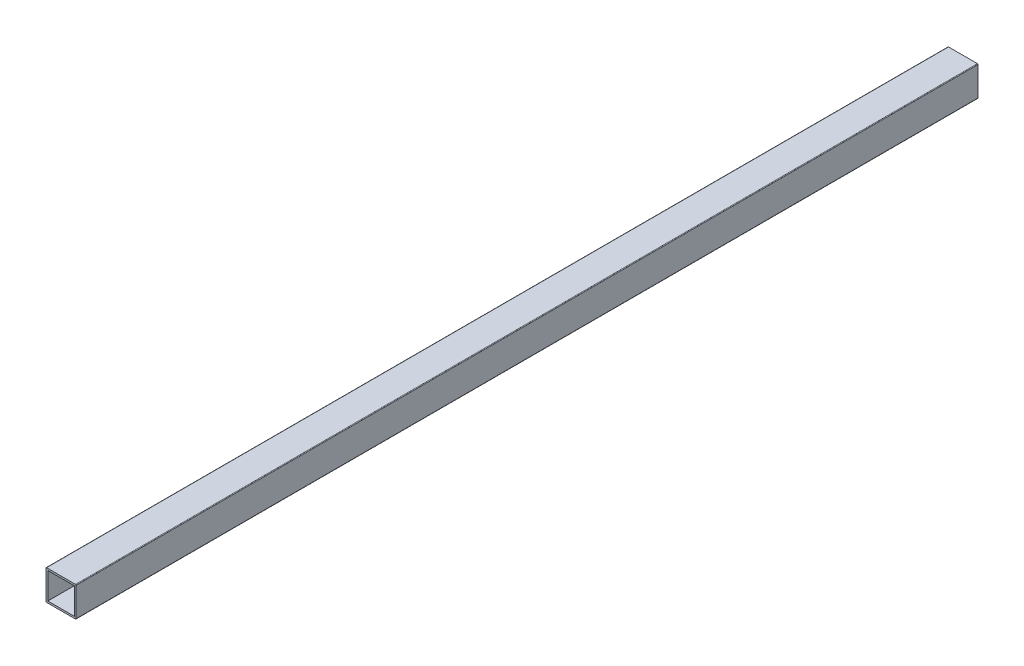
ISO-10303-21;
HEADER;
FILE_DESCRIPTION(('STEP AP214'),'2;1');
FILE_NAME('part.step','',(''),(''),'','','');
FILE_SCHEMA(('AUTOMOTIVE_DESIGN { 1 0 10303 214 1 1 1 1 }'));
ENDSEC;
DATA;
#1=APPLICATION_CONTEXT('core data for automotive mechanical design processes');
#2=APPLICATION_PROTOCOL_DEFINITION('international standard','automotive_design',2000,#1);
#3=PRODUCT_CONTEXT('',#1,'mechanical');
#4=PRODUCT('Part','Part','',(#3));
#5=PRODUCT_RELATED_PRODUCT_CATEGORY('part','',(#4));
#6=PRODUCT_DEFINITION_FORMATION('','',#4);
#7=PRODUCT_DEFINITION_CONTEXT('part definition',#1,'design');
#8=PRODUCT_DEFINITION('design','',#6,#7);
#9=PRODUCT_DEFINITION_SHAPE('','',#8);
#10=(LENGTH_UNIT() NAMED_UNIT(*) SI_UNIT(.MILLI.,.METRE.));
#11=(NAMED_UNIT(*) PLANE_ANGLE_UNIT() SI_UNIT($,.RADIAN.));
#12=(NAMED_UNIT(*) SI_UNIT($,.STERADIAN.) SOLID_ANGLE_UNIT());
#13=UNCERTAINTY_MEASURE_WITH_UNIT(LENGTH_MEASURE(1.E-05),#10,'distance_accuracy_value','');
#14=(GEOMETRIC_REPRESENTATION_CONTEXT(3) GLOBAL_UNCERTAINTY_ASSIGNED_CONTEXT((#13)) GLOBAL_UNIT_ASSIGNED_CONTEXT((#10,
#11,#12)) REPRESENTATION_CONTEXT('',''));
#15=CARTESIAN_POINT('',(0.,0.,0.));
#16=DIRECTION('',(0.,0.,1.));
#17=DIRECTION('',(1.,0.,0.));
#18=AXIS2_PLACEMENT_3D('',#15,#16,#17);
#19=CARTESIAN_POINT('',(24.,24.,1500.));
#20=DIRECTION('',(0.,0.,-1.));
#21=DIRECTION('',(-1.,0.,0.));
#22=AXIS2_PLACEMENT_3D('',#19,#20,#21);
#23=PLANE('',#22);
#24=CARTESIAN_POINT('',(24.,24.,1500.));
#25=DIRECTION('',(0.,0.,1.));
#26=DIRECTION('',(-1.,0.,0.));
#27=AXIS2_PLACEMENT_3D('',#24,#25,#26);
#28=CIRCLE('',#27,1.);
#29=CARTESIAN_POINT('',(25.,24.,1500.));
#30=VERTEX_POINT('',#29);
#31=CARTESIAN_POINT('',(24.,25.,1500.));
#32=VERTEX_POINT('',#31);
#33=EDGE_CURVE('E179',#30,#32,#28,.T.);
#34=ORIENTED_EDGE('',*,*,#33,.T.);
#35=DIRECTION('',(-1.,0.,0.));
#36=VECTOR('',#35,1.);
#37=CARTESIAN_POINT('',(24.,25.,1500.));
#38=LINE('',#37,#36);
#39=CARTESIAN_POINT('',(-24.,25.,1500.));
#40=VERTEX_POINT('',#39);
#41=EDGE_CURVE('E183',#32,#40,#38,.T.);
#42=ORIENTED_EDGE('',*,*,#41,.T.);
#43=CARTESIAN_POINT('',(-24.,24.,1500.));
#44=DIRECTION('',(0.,0.,1.));
#45=DIRECTION('',(-1.,0.,0.));
#46=AXIS2_PLACEMENT_3D('',#43,#44,#45);
#47=CIRCLE('',#46,1.);
#48=CARTESIAN_POINT('',(-25.,24.,1500.));
#49=VERTEX_POINT('',#48);
#50=EDGE_CURVE('E187',#40,#49,#47,.T.);
#51=ORIENTED_EDGE('',*,*,#50,.T.);
#52=DIRECTION('',(0.,-1.,0.));
#53=VECTOR('',#52,1.);
#54=CARTESIAN_POINT('',(-25.,24.,1500.));
#55=LINE('',#54,#53);
#56=CARTESIAN_POINT('',(-25.,-24.,1500.));
#57=VERTEX_POINT('',#56);
#58=EDGE_CURVE('E190',#49,#57,#55,.T.);
#59=ORIENTED_EDGE('',*,*,#58,.T.);
#60=CARTESIAN_POINT('',(-24.,-24.,1500.));
#61=DIRECTION('',(0.,0.,1.));
#62=DIRECTION('',(-1.,0.,0.));
#63=AXIS2_PLACEMENT_3D('',#60,#61,#62);
#64=CIRCLE('',#63,1.);
#65=CARTESIAN_POINT('',(-24.,-25.,1500.));
#66=VERTEX_POINT('',#65);
#67=EDGE_CURVE('E193',#57,#66,#64,.T.);
#68=ORIENTED_EDGE('',*,*,#67,.T.);
#69=DIRECTION('',(1.,0.,0.));
#70=VECTOR('',#69,1.);
#71=CARTESIAN_POINT('',(24.,-25.,1500.));
#72=LINE('',#71,#70);
#73=CARTESIAN_POINT('',(24.,-25.,1500.));
#74=VERTEX_POINT('',#73);
#75=EDGE_CURVE('E196',#66,#74,#72,.T.);
#76=ORIENTED_EDGE('',*,*,#75,.T.);
#77=CARTESIAN_POINT('',(24.,-24.,1500.));
#78=DIRECTION('',(0.,0.,1.));
#79=DIRECTION('',(1.,0.,0.));
#80=AXIS2_PLACEMENT_3D('',#77,#78,#79);
#81=CIRCLE('',#80,1.);
#82=CARTESIAN_POINT('',(25.,-24.,1500.));
#83=VERTEX_POINT('',#82);
#84=EDGE_CURVE('E199',#74,#83,#81,.T.);
#85=ORIENTED_EDGE('',*,*,#84,.T.);
#86=DIRECTION('',(0.,1.,0.));
#87=VECTOR('',#86,1.);
#88=CARTESIAN_POINT('',(25.,24.,1500.));
#89=LINE('',#88,#87);
#90=EDGE_CURVE('E202',#83,#30,#89,.T.);
#91=ORIENTED_EDGE('',*,*,#90,.T.);
#92=EDGE_LOOP('',(#34,#42,#51,#59,#68,#76,#85,#91));
#93=FACE_BOUND('',#92,.T.);
#94=DIRECTION('',(0.,1.,0.));
#95=VECTOR('',#94,1.);
#96=CARTESIAN_POINT('',(22.,22.,1500.));
#97=LINE('',#96,#95);
#98=CARTESIAN_POINT('',(22.,-22.,1500.));
#99=VERTEX_POINT('',#98);
#100=CARTESIAN_POINT('',(22.,22.,1500.));
#101=VERTEX_POINT('',#100);
#102=EDGE_CURVE('E131',#99,#101,#97,.T.);
#103=ORIENTED_EDGE('',*,*,#102,.F.);
#104=DIRECTION('',(1.,0.,0.));
#105=VECTOR('',#104,1.);
#106=CARTESIAN_POINT('',(22.,-22.,1500.));
#107=LINE('',#106,#105);
#108=CARTESIAN_POINT('',(-22.,-22.,1500.));
#109=VERTEX_POINT('',#108);
#110=EDGE_CURVE('E157',#109,#99,#107,.T.);
#111=ORIENTED_EDGE('',*,*,#110,.F.);
#112=DIRECTION('',(0.,-1.,0.));
#113=VECTOR('',#112,1.);
#114=CARTESIAN_POINT('',(-22.,22.,1500.));
#115=LINE('',#114,#113);
#116=CARTESIAN_POINT('',(-22.,22.,1500.));
#117=VERTEX_POINT('',#116);
#118=EDGE_CURVE('E153',#117,#109,#115,.T.);
#119=ORIENTED_EDGE('',*,*,#118,.F.);
#120=DIRECTION('',(-1.,0.,0.));
#121=VECTOR('',#120,1.);
#122=CARTESIAN_POINT('',(22.,22.,1500.));
#123=LINE('',#122,#121);
#124=EDGE_CURVE('E140',#101,#117,#123,.T.);
#125=ORIENTED_EDGE('',*,*,#124,.F.);
#126=EDGE_LOOP('',(#103,#111,#119,#125));
#127=FACE_BOUND('',#126,.T.);
#128=ADVANCED_FACE('F41',(#93,#127),#23,.F.);
#129=CARTESIAN_POINT('',(24.,24.,0.));
#130=DIRECTION('',(0.,0.,-1.));
#131=DIRECTION('',(-1.,0.,0.));
#132=AXIS2_PLACEMENT_3D('',#129,#130,#131);
#133=PLANE('',#132);
#134=CARTESIAN_POINT('',(24.,24.,0.));
#135=DIRECTION('',(0.,0.,1.));
#136=DIRECTION('',(-1.,0.,0.));
#137=AXIS2_PLACEMENT_3D('',#134,#135,#136);
#138=CIRCLE('',#137,1.);
#139=CARTESIAN_POINT('',(25.,24.,0.));
#140=VERTEX_POINT('',#139);
#141=CARTESIAN_POINT('',(24.,25.,0.));
#142=VERTEX_POINT('',#141);
#143=EDGE_CURVE('E149',#140,#142,#138,.T.);
#144=ORIENTED_EDGE('',*,*,#143,.F.);
#145=DIRECTION('',(0.,1.,0.));
#146=VECTOR('',#145,1.);
#147=CARTESIAN_POINT('',(25.,24.,0.));
#148=LINE('',#147,#146);
#149=CARTESIAN_POINT('',(25.,-24.,0.));
#150=VERTEX_POINT('',#149);
#151=EDGE_CURVE('E184',#150,#140,#148,.T.);
#152=ORIENTED_EDGE('',*,*,#151,.F.);
#153=CARTESIAN_POINT('',(24.,-24.,0.));
#154=DIRECTION('',(0.,0.,1.));
#155=DIRECTION('',(1.,0.,0.));
#156=AXIS2_PLACEMENT_3D('',#153,#154,#155);
#157=CIRCLE('',#156,1.);
#158=CARTESIAN_POINT('',(24.,-25.,0.));
#159=VERTEX_POINT('',#158);
#160=EDGE_CURVE('E224',#159,#150,#157,.T.);
#161=ORIENTED_EDGE('',*,*,#160,.F.);
#162=DIRECTION('',(1.,0.,0.));
#163=VECTOR('',#162,1.);
#164=CARTESIAN_POINT('',(24.,-25.,0.));
#165=LINE('',#164,#163);
#166=CARTESIAN_POINT('',(-24.,-25.,0.));
#167=VERTEX_POINT('',#166);
#168=EDGE_CURVE('E221',#167,#159,#165,.T.);
#169=ORIENTED_EDGE('',*,*,#168,.F.);
#170=CARTESIAN_POINT('',(-24.,-24.,0.));
#171=DIRECTION('',(0.,0.,1.));
#172=DIRECTION('',(-1.,0.,0.));
#173=AXIS2_PLACEMENT_3D('',#170,#171,#172);
#174=CIRCLE('',#173,1.);
#175=CARTESIAN_POINT('',(-25.,-24.,0.));
#176=VERTEX_POINT('',#175);
#177=EDGE_CURVE('E218',#176,#167,#174,.T.);
#178=ORIENTED_EDGE('',*,*,#177,.F.);
#179=DIRECTION('',(0.,-1.,0.));
#180=VECTOR('',#179,1.);
#181=CARTESIAN_POINT('',(-25.,24.,0.));
#182=LINE('',#181,#180);
#183=CARTESIAN_POINT('',(-25.,24.,0.));
#184=VERTEX_POINT('',#183);
#185=EDGE_CURVE('E215',#184,#176,#182,.T.);
#186=ORIENTED_EDGE('',*,*,#185,.F.);
#187=CARTESIAN_POINT('',(-24.,24.,0.));
#188=DIRECTION('',(0.,0.,1.));
#189=DIRECTION('',(-1.,0.,0.));
#190=AXIS2_PLACEMENT_3D('',#187,#188,#189);
#191=CIRCLE('',#190,1.);
#192=CARTESIAN_POINT('',(-24.,25.,0.));
#193=VERTEX_POINT('',#192);
#194=EDGE_CURVE('E212',#193,#184,#191,.T.);
#195=ORIENTED_EDGE('',*,*,#194,.F.);
#196=DIRECTION('',(-1.,0.,0.));
#197=VECTOR('',#196,1.);
#198=CARTESIAN_POINT('',(24.,25.,0.));
#199=LINE('',#198,#197);
#200=EDGE_CURVE('E209',#142,#193,#199,.T.);
#201=ORIENTED_EDGE('',*,*,#200,.F.);
#202=EDGE_LOOP('',(#144,#152,#161,#169,#178,#186,#195,#201));
#203=FACE_BOUND('',#202,.T.);
#204=DIRECTION('',(1.,0.,0.));
#205=VECTOR('',#204,1.);
#206=CARTESIAN_POINT('',(22.,-22.,0.));
#207=LINE('',#206,#205);
#208=CARTESIAN_POINT('',(-22.,-22.,0.));
#209=VERTEX_POINT('',#208);
#210=CARTESIAN_POINT('',(22.,-22.,0.));
#211=VERTEX_POINT('',#210);
#212=EDGE_CURVE('E141',#209,#211,#207,.T.);
#213=ORIENTED_EDGE('',*,*,#212,.T.);
#214=DIRECTION('',(0.,1.,0.));
#215=VECTOR('',#214,1.);
#216=CARTESIAN_POINT('',(22.,22.,0.));
#217=LINE('',#216,#215);
#218=CARTESIAN_POINT('',(22.,22.,0.));
#219=VERTEX_POINT('',#218);
#220=EDGE_CURVE('E65',#211,#219,#217,.T.);
#221=ORIENTED_EDGE('',*,*,#220,.T.);
#222=DIRECTION('',(-1.,0.,0.));
#223=VECTOR('',#222,1.);
#224=CARTESIAN_POINT('',(22.,22.,0.));
#225=LINE('',#224,#223);
#226=CARTESIAN_POINT('',(-22.,22.,0.));
#227=VERTEX_POINT('',#226);
#228=EDGE_CURVE('E147',#219,#227,#225,.T.);
#229=ORIENTED_EDGE('',*,*,#228,.T.);
#230=DIRECTION('',(0.,-1.,0.));
#231=VECTOR('',#230,1.);
#232=CARTESIAN_POINT('',(-22.,22.,0.));
#233=LINE('',#232,#231);
#234=EDGE_CURVE('E166',#227,#209,#233,.T.);
#235=ORIENTED_EDGE('',*,*,#234,.T.);
#236=EDGE_LOOP('',(#213,#221,#229,#235));
#237=FACE_BOUND('',#236,.T.);
#238=ADVANCED_FACE('F263',(#203,#237),#133,.T.);
#239=CARTESIAN_POINT('',(24.,24.,1500.));
#240=DIRECTION('',(0.,0.,-1.));
#241=DIRECTION('',(-1.,0.,0.));
#242=AXIS2_PLACEMENT_3D('',#239,#240,#241);
#243=CYLINDRICAL_SURFACE('',#242,1.);
#244=ORIENTED_EDGE('',*,*,#143,.T.);
#245=DIRECTION('',(0.,0.,-1.));
#246=VECTOR('',#245,1.);
#247=CARTESIAN_POINT('',(24.,25.,1500.));
#248=LINE('',#247,#246);
#249=EDGE_CURVE('E11',#32,#142,#248,.T.);
#250=ORIENTED_EDGE('',*,*,#249,.F.);
#251=ORIENTED_EDGE('',*,*,#33,.F.);
#252=DIRECTION('',(0.,0.,-1.));
#253=VECTOR('',#252,1.);
#254=CARTESIAN_POINT('',(25.,24.,1500.));
#255=LINE('',#254,#253);
#256=EDGE_CURVE('E205',#30,#140,#255,.T.);
#257=ORIENTED_EDGE('',*,*,#256,.T.);
#258=EDGE_LOOP('',(#244,#250,#251,#257));
#259=FACE_BOUND('',#258,.T.);
#260=ADVANCED_FACE('F43',(#259),#243,.T.);
#261=CARTESIAN_POINT('',(24.,25.,1500.));
#262=DIRECTION('',(0.,-1.,0.));
#263=DIRECTION('',(1.,0.,0.));
#264=AXIS2_PLACEMENT_3D('',#261,#262,#263);
#265=PLANE('',#264);
#266=ORIENTED_EDGE('',*,*,#200,.T.);
#267=DIRECTION('',(0.,0.,-1.));
#268=VECTOR('',#267,1.);
#269=CARTESIAN_POINT('',(-24.,25.,1500.));
#270=LINE('',#269,#268);
#271=EDGE_CURVE('E50',#40,#193,#270,.T.);
#272=ORIENTED_EDGE('',*,*,#271,.F.);
#273=ORIENTED_EDGE('',*,*,#41,.F.);
#274=ORIENTED_EDGE('',*,*,#249,.T.);
#275=EDGE_LOOP('',(#266,#272,#273,#274));
#276=FACE_BOUND('',#275,.T.);
#277=ADVANCED_FACE('F280',(#276),#265,.F.);
#278=CARTESIAN_POINT('',(-24.,24.,1500.));
#279=DIRECTION('',(0.,0.,-1.));
#280=DIRECTION('',(-1.,0.,0.));
#281=AXIS2_PLACEMENT_3D('',#278,#279,#280);
#282=CYLINDRICAL_SURFACE('',#281,1.);
#283=ORIENTED_EDGE('',*,*,#194,.T.);
#284=DIRECTION('',(0.,0.,-1.));
#285=VECTOR('',#284,1.);
#286=CARTESIAN_POINT('',(-25.,24.,1500.));
#287=LINE('',#286,#285);
#288=EDGE_CURVE('E248',#49,#184,#287,.T.);
#289=ORIENTED_EDGE('',*,*,#288,.F.);
#290=ORIENTED_EDGE('',*,*,#50,.F.);
#291=ORIENTED_EDGE('',*,*,#271,.T.);
#292=EDGE_LOOP('',(#283,#289,#290,#291));
#293=FACE_BOUND('',#292,.T.);
#294=ADVANCED_FACE('F257',(#293),#282,.T.);
#295=CARTESIAN_POINT('',(-25.,24.,1500.));
#296=DIRECTION('',(1.,0.,0.));
#297=DIRECTION('',(0.,1.,0.));
#298=AXIS2_PLACEMENT_3D('',#295,#296,#297);
#299=PLANE('',#298);
#300=ORIENTED_EDGE('',*,*,#185,.T.);
#301=DIRECTION('',(0.,0.,-1.));
#302=VECTOR('',#301,1.);
#303=CARTESIAN_POINT('',(-25.,-24.,1500.));
#304=LINE('',#303,#302);
#305=EDGE_CURVE('E244',#57,#176,#304,.T.);
#306=ORIENTED_EDGE('',*,*,#305,.F.);
#307=ORIENTED_EDGE('',*,*,#58,.F.);
#308=ORIENTED_EDGE('',*,*,#288,.T.);
#309=EDGE_LOOP('',(#300,#306,#307,#308));
#310=FACE_BOUND('',#309,.T.);
#311=ADVANCED_FACE('F269',(#310),#299,.F.);
#312=CARTESIAN_POINT('',(-24.,-24.,1500.));
#313=DIRECTION('',(0.,0.,-1.));
#314=DIRECTION('',(-1.,0.,0.));
#315=AXIS2_PLACEMENT_3D('',#312,#313,#314);
#316=CYLINDRICAL_SURFACE('',#315,1.);
#317=ORIENTED_EDGE('',*,*,#177,.T.);
#318=DIRECTION('',(0.,0.,-1.));
#319=VECTOR('',#318,1.);
#320=CARTESIAN_POINT('',(-24.,-25.,1500.));
#321=LINE('',#320,#319);
#322=EDGE_CURVE('E240',#66,#167,#321,.T.);
#323=ORIENTED_EDGE('',*,*,#322,.F.);
#324=ORIENTED_EDGE('',*,*,#67,.F.);
#325=ORIENTED_EDGE('',*,*,#305,.T.);
#326=EDGE_LOOP('',(#317,#323,#324,#325));
#327=FACE_BOUND('',#326,.T.);
#328=ADVANCED_FACE('F273',(#327),#316,.T.);
#329=CARTESIAN_POINT('',(24.,-25.,1500.));
#330=DIRECTION('',(0.,1.,0.));
#331=DIRECTION('',(-1.,0.,0.));
#332=AXIS2_PLACEMENT_3D('',#329,#330,#331);
#333=PLANE('',#332);
#334=ORIENTED_EDGE('',*,*,#168,.T.);
#335=DIRECTION('',(0.,0.,-1.));
#336=VECTOR('',#335,1.);
#337=CARTESIAN_POINT('',(24.,-25.,1500.));
#338=LINE('',#337,#336);
#339=EDGE_CURVE('E236',#74,#159,#338,.T.);
#340=ORIENTED_EDGE('',*,*,#339,.F.);
#341=ORIENTED_EDGE('',*,*,#75,.F.);
#342=ORIENTED_EDGE('',*,*,#322,.T.);
#343=EDGE_LOOP('',(#334,#340,#341,#342));
#344=FACE_BOUND('',#343,.T.);
#345=ADVANCED_FACE('F293',(#344),#333,.F.);
#346=CARTESIAN_POINT('',(24.,-24.,1500.));
#347=DIRECTION('',(0.,0.,-1.));
#348=DIRECTION('',(-1.,0.,0.));
#349=AXIS2_PLACEMENT_3D('',#346,#347,#348);
#350=CYLINDRICAL_SURFACE('',#349,1.);
#351=ORIENTED_EDGE('',*,*,#160,.T.);
#352=DIRECTION('',(0.,0.,-1.));
#353=VECTOR('',#352,1.);
#354=CARTESIAN_POINT('',(25.,-24.,1500.));
#355=LINE('',#354,#353);
#356=EDGE_CURVE('E232',#83,#150,#355,.T.);
#357=ORIENTED_EDGE('',*,*,#356,.F.);
#358=ORIENTED_EDGE('',*,*,#84,.F.);
#359=ORIENTED_EDGE('',*,*,#339,.T.);
#360=EDGE_LOOP('',(#351,#357,#358,#359));
#361=FACE_BOUND('',#360,.T.);
#362=ADVANCED_FACE('F291',(#361),#350,.T.);
#363=CARTESIAN_POINT('',(25.,24.,1500.));
#364=DIRECTION('',(-1.,0.,0.));
#365=DIRECTION('',(0.,-1.,0.));
#366=AXIS2_PLACEMENT_3D('',#363,#364,#365);
#367=PLANE('',#366);
#368=ORIENTED_EDGE('',*,*,#151,.T.);
#369=ORIENTED_EDGE('',*,*,#256,.F.);
#370=ORIENTED_EDGE('',*,*,#90,.F.);
#371=ORIENTED_EDGE('',*,*,#356,.T.);
#372=EDGE_LOOP('',(#368,#369,#370,#371));
#373=FACE_BOUND('',#372,.T.);
#374=ADVANCED_FACE('F286',(#373),#367,.F.);
#375=CARTESIAN_POINT('',(22.,22.,1500.));
#376=DIRECTION('',(-1.,0.,0.));
#377=DIRECTION('',(0.,-1.,0.));
#378=AXIS2_PLACEMENT_3D('',#375,#376,#377);
#379=PLANE('',#378);
#380=ORIENTED_EDGE('',*,*,#220,.F.);
#381=DIRECTION('',(0.,0.,-1.));
#382=VECTOR('',#381,1.);
#383=CARTESIAN_POINT('',(22.,-22.,1500.));
#384=LINE('',#383,#382);
#385=EDGE_CURVE('E135',#99,#211,#384,.T.);
#386=ORIENTED_EDGE('',*,*,#385,.F.);
#387=ORIENTED_EDGE('',*,*,#102,.T.);
#388=DIRECTION('',(0.,0.,-1.));
#389=VECTOR('',#388,1.);
#390=CARTESIAN_POINT('',(22.,22.,1500.));
#391=LINE('',#390,#389);
#392=EDGE_CURVE('E134',#101,#219,#391,.T.);
#393=ORIENTED_EDGE('',*,*,#392,.T.);
#394=EDGE_LOOP('',(#380,#386,#387,#393));
#395=FACE_BOUND('',#394,.T.);
#396=ADVANCED_FACE('F133',(#395),#379,.T.);
#397=CARTESIAN_POINT('',(22.,22.,1500.));
#398=DIRECTION('',(0.,-1.,0.));
#399=DIRECTION('',(1.,0.,0.));
#400=AXIS2_PLACEMENT_3D('',#397,#398,#399);
#401=PLANE('',#400);
#402=ORIENTED_EDGE('',*,*,#228,.F.);
#403=ORIENTED_EDGE('',*,*,#392,.F.);
#404=ORIENTED_EDGE('',*,*,#124,.T.);
#405=DIRECTION('',(0.,0.,-1.));
#406=VECTOR('',#405,1.);
#407=CARTESIAN_POINT('',(-22.,22.,1500.));
#408=LINE('',#407,#406);
#409=EDGE_CURVE('E150',#117,#227,#408,.T.);
#410=ORIENTED_EDGE('',*,*,#409,.T.);
#411=EDGE_LOOP('',(#402,#403,#404,#410));
#412=FACE_BOUND('',#411,.T.);
#413=ADVANCED_FACE('F144',(#412),#401,.T.);
#414=CARTESIAN_POINT('',(-22.,22.,1500.));
#415=DIRECTION('',(1.,0.,0.));
#416=DIRECTION('',(0.,1.,0.));
#417=AXIS2_PLACEMENT_3D('',#414,#415,#416);
#418=PLANE('',#417);
#419=ORIENTED_EDGE('',*,*,#234,.F.);
#420=ORIENTED_EDGE('',*,*,#409,.F.);
#421=ORIENTED_EDGE('',*,*,#118,.T.);
#422=DIRECTION('',(0.,0.,-1.));
#423=VECTOR('',#422,1.);
#424=CARTESIAN_POINT('',(-22.,-22.,1500.));
#425=LINE('',#424,#423);
#426=EDGE_CURVE('E57',#109,#209,#425,.T.);
#427=ORIENTED_EDGE('',*,*,#426,.T.);
#428=EDGE_LOOP('',(#419,#420,#421,#427));
#429=FACE_BOUND('',#428,.T.);
#430=ADVANCED_FACE('F318',(#429),#418,.T.);
#431=CARTESIAN_POINT('',(22.,-22.,1500.));
#432=DIRECTION('',(0.,1.,0.));
#433=DIRECTION('',(-1.,0.,0.));
#434=AXIS2_PLACEMENT_3D('',#431,#432,#433);
#435=PLANE('',#434);
#436=ORIENTED_EDGE('',*,*,#212,.F.);
#437=ORIENTED_EDGE('',*,*,#426,.F.);
#438=ORIENTED_EDGE('',*,*,#110,.T.);
#439=ORIENTED_EDGE('',*,*,#385,.T.);
#440=EDGE_LOOP('',(#436,#437,#438,#439));
#441=FACE_BOUND('',#440,.T.);
#442=ADVANCED_FACE('F322',(#441),#435,.T.);
#443=CLOSED_SHELL('',(#128,#238,#260,#277,#294,#311,#328,#345,#362,#374,#396,#413,#430,#442));
#444=MANIFOLD_SOLID_BREP('B2',#443);
#445=ADVANCED_BREP_SHAPE_REPRESENTATION('',(#18,#444),#14);
#446=SHAPE_DEFINITION_REPRESENTATION(#9,#445);
ENDSEC;
END-ISO-10303-21;
